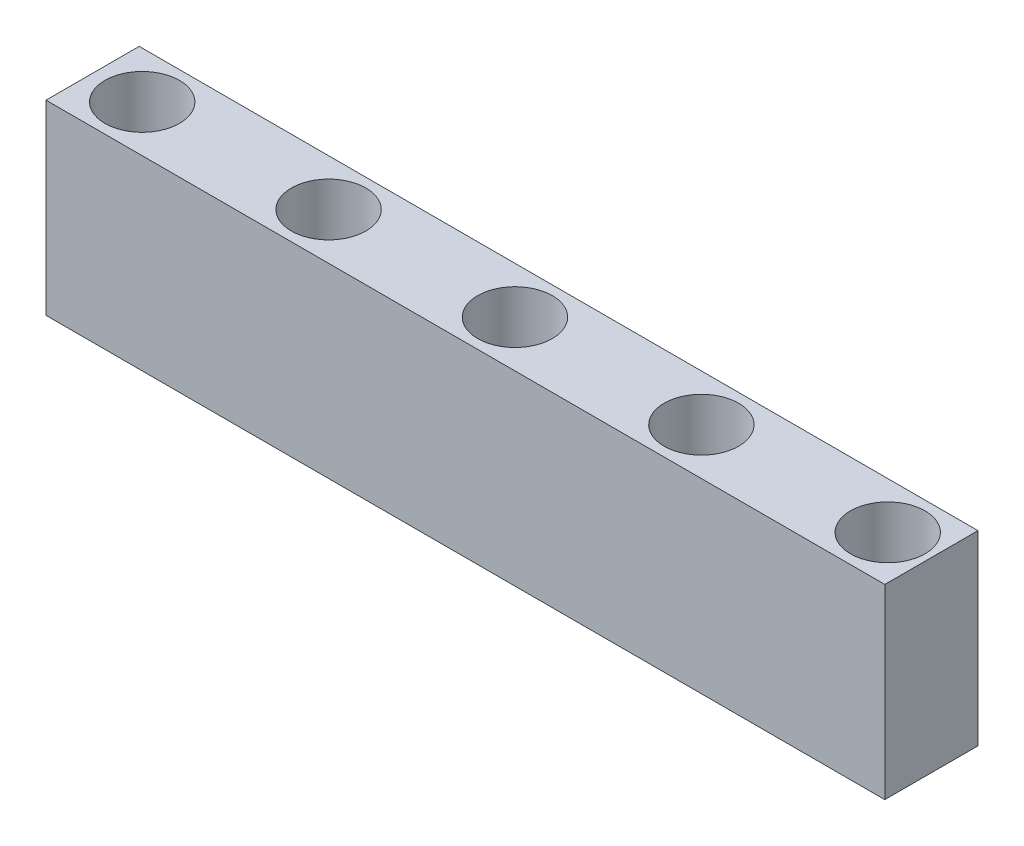
ISO-10303-21;
HEADER;
FILE_DESCRIPTION(('STEP AP214'),'2;1');
FILE_NAME('part.step','',(''),(''),'','','');
FILE_SCHEMA(('AUTOMOTIVE_DESIGN { 1 0 10303 214 1 1 1 1 }'));
ENDSEC;
DATA;
#1=APPLICATION_CONTEXT('core data for automotive mechanical design processes');
#2=APPLICATION_PROTOCOL_DEFINITION('international standard','automotive_design',2000,#1);
#3=PRODUCT_CONTEXT('',#1,'mechanical');
#4=PRODUCT('Part','Part','',(#3));
#5=PRODUCT_RELATED_PRODUCT_CATEGORY('part','',(#4));
#6=PRODUCT_DEFINITION_FORMATION('','',#4);
#7=PRODUCT_DEFINITION_CONTEXT('part definition',#1,'design');
#8=PRODUCT_DEFINITION('design','',#6,#7);
#9=PRODUCT_DEFINITION_SHAPE('','',#8);
#10=(LENGTH_UNIT() NAMED_UNIT(*) SI_UNIT(.MILLI.,.METRE.));
#11=(NAMED_UNIT(*) PLANE_ANGLE_UNIT() SI_UNIT($,.RADIAN.));
#12=(NAMED_UNIT(*) SI_UNIT($,.STERADIAN.) SOLID_ANGLE_UNIT());
#13=UNCERTAINTY_MEASURE_WITH_UNIT(LENGTH_MEASURE(1.E-05),#10,'distance_accuracy_value','');
#14=(GEOMETRIC_REPRESENTATION_CONTEXT(3) GLOBAL_UNCERTAINTY_ASSIGNED_CONTEXT((#13)) GLOBAL_UNIT_ASSIGNED_CONTEXT((#10,
#11,#12)) REPRESENTATION_CONTEXT('',''));
#15=CARTESIAN_POINT('',(0.,0.,0.));
#16=DIRECTION('',(0.,0.,1.));
#17=DIRECTION('',(1.,0.,0.));
#18=AXIS2_PLACEMENT_3D('',#15,#16,#17);
#19=CARTESIAN_POINT('',(0.,10.,0.));
#20=DIRECTION('',(0.,1.,0.));
#21=DIRECTION('',(0.,0.,1.));
#22=AXIS2_PLACEMENT_3D('',#19,#20,#21);
#23=PLANE('',#22);
#24=DIRECTION('',(0.,0.,1.));
#25=VECTOR('',#24,1.);
#26=CARTESIAN_POINT('',(5.0039410444942,10.,-2.5));
#27=LINE('',#26,#25);
#28=CARTESIAN_POINT('',(5.0039410444942,10.,-2.5));
#29=VERTEX_POINT('',#28);
#30=CARTESIAN_POINT('',(5.0039410444942,10.,2.5));
#31=VERTEX_POINT('',#30);
#32=EDGE_CURVE('E54',#29,#31,#27,.T.);
#33=ORIENTED_EDGE('',*,*,#32,.F.);
#34=DIRECTION('',(-1.,0.,0.));
#35=VECTOR('',#34,1.);
#36=CARTESIAN_POINT('',(-40.,10.,-2.5));
#37=LINE('',#36,#35);
#38=CARTESIAN_POINT('',(-40.,10.,-2.5));
#39=VERTEX_POINT('',#38);
#40=EDGE_CURVE('E98',#29,#39,#37,.T.);
#41=ORIENTED_EDGE('',*,*,#40,.T.);
#42=DIRECTION('',(0.,0.,1.));
#43=VECTOR('',#42,1.);
#44=CARTESIAN_POINT('',(-40.,10.,-2.5));
#45=LINE('',#44,#43);
#46=CARTESIAN_POINT('',(-40.,10.,2.5));
#47=VERTEX_POINT('',#46);
#48=EDGE_CURVE('E63',#39,#47,#45,.T.);
#49=ORIENTED_EDGE('',*,*,#48,.T.);
#50=DIRECTION('',(1.,0.,0.));
#51=VECTOR('',#50,1.);
#52=CARTESIAN_POINT('',(-40.,10.,2.5));
#53=LINE('',#52,#51);
#54=EDGE_CURVE('E90',#47,#31,#53,.T.);
#55=ORIENTED_EDGE('',*,*,#54,.T.);
#56=EDGE_LOOP('',(#33,#41,#49,#55));
#57=FACE_BOUND('',#56,.T.);
#58=CARTESIAN_POINT('',(-7.3381992204159,10.,0.));
#59=DIRECTION('',(0.,1.,0.));
#60=DIRECTION('',(0.,0.,1.));
#61=AXIS2_PLACEMENT_3D('',#58,#59,#60);
#62=CIRCLE('',#61,2.);
#63=CARTESIAN_POINT('',(-7.3381992204159,10.,2.));
#64=VERTEX_POINT('',#63);
#65=EDGE_CURVE('E130',#64,#64,#62,.T.);
#66=ORIENTED_EDGE('',*,*,#65,.F.);
#67=EDGE_LOOP('',(#66));
#68=FACE_BOUND('',#67,.T.);
#69=CARTESIAN_POINT('',(-27.3381992204159,10.,0.));
#70=DIRECTION('',(0.,1.,0.));
#71=DIRECTION('',(0.,0.,1.));
#72=AXIS2_PLACEMENT_3D('',#69,#70,#71);
#73=CIRCLE('',#72,2.);
#74=CARTESIAN_POINT('',(-27.3381992204159,10.,2.));
#75=VERTEX_POINT('',#74);
#76=EDGE_CURVE('E114',#75,#75,#73,.T.);
#77=ORIENTED_EDGE('',*,*,#76,.F.);
#78=EDGE_LOOP('',(#77));
#79=FACE_BOUND('',#78,.T.);
#80=CARTESIAN_POINT('',(-37.3381992204159,10.,0.));
#81=DIRECTION('',(0.,1.,0.));
#82=DIRECTION('',(0.,0.,1.));
#83=AXIS2_PLACEMENT_3D('',#80,#81,#82);
#84=CIRCLE('',#83,2.);
#85=CARTESIAN_POINT('',(-37.3381992204159,10.,2.));
#86=VERTEX_POINT('',#85);
#87=EDGE_CURVE('E105',#86,#86,#84,.T.);
#88=ORIENTED_EDGE('',*,*,#87,.F.);
#89=EDGE_LOOP('',(#88));
#90=FACE_BOUND('',#89,.T.);
#91=CARTESIAN_POINT('',(-17.3381992204159,10.,0.));
#92=DIRECTION('',(0.,1.,0.));
#93=DIRECTION('',(0.,0.,1.));
#94=AXIS2_PLACEMENT_3D('',#91,#92,#93);
#95=CIRCLE('',#94,2.);
#96=CARTESIAN_POINT('',(-17.3381992204159,10.,2.));
#97=VERTEX_POINT('',#96);
#98=EDGE_CURVE('E122',#97,#97,#95,.T.);
#99=ORIENTED_EDGE('',*,*,#98,.F.);
#100=EDGE_LOOP('',(#99));
#101=FACE_BOUND('',#100,.T.);
#102=CARTESIAN_POINT('',(2.6618007795841,10.,0.));
#103=DIRECTION('',(0.,1.,0.));
#104=DIRECTION('',(0.,0.,1.));
#105=AXIS2_PLACEMENT_3D('',#102,#103,#104);
#106=CIRCLE('',#105,2.);
#107=CARTESIAN_POINT('',(2.6618007795841,10.,2.));
#108=VERTEX_POINT('',#107);
#109=EDGE_CURVE('E138',#108,#108,#106,.T.);
#110=ORIENTED_EDGE('',*,*,#109,.F.);
#111=EDGE_LOOP('',(#110));
#112=FACE_BOUND('',#111,.T.);
#113=ADVANCED_FACE('F38',(#57,#68,#79,#90,#101,#112),#23,.T.);
#114=CARTESIAN_POINT('',(0.,0.,0.));
#115=DIRECTION('',(0.,1.,0.));
#116=DIRECTION('',(0.,0.,1.));
#117=AXIS2_PLACEMENT_3D('',#114,#115,#116);
#118=PLANE('',#117);
#119=DIRECTION('',(-1.,0.,0.));
#120=VECTOR('',#119,1.);
#121=CARTESIAN_POINT('',(-40.,0.,-2.5));
#122=LINE('',#121,#120);
#123=CARTESIAN_POINT('',(5.0039410444942,0.,-2.5));
#124=VERTEX_POINT('',#123);
#125=CARTESIAN_POINT('',(-40.,0.,-2.5));
#126=VERTEX_POINT('',#125);
#127=EDGE_CURVE('E85',#124,#126,#122,.T.);
#128=ORIENTED_EDGE('',*,*,#127,.F.);
#129=DIRECTION('',(0.,0.,1.));
#130=VECTOR('',#129,1.);
#131=CARTESIAN_POINT('',(5.0039410444942,0.,-2.5));
#132=LINE('',#131,#130);
#133=CARTESIAN_POINT('',(5.0039410444942,0.,2.5));
#134=VERTEX_POINT('',#133);
#135=EDGE_CURVE('E96',#124,#134,#132,.T.);
#136=ORIENTED_EDGE('',*,*,#135,.T.);
#137=DIRECTION('',(1.,0.,0.));
#138=VECTOR('',#137,1.);
#139=CARTESIAN_POINT('',(-40.,0.,2.5));
#140=LINE('',#139,#138);
#141=CARTESIAN_POINT('',(-40.,0.,2.5));
#142=VERTEX_POINT('',#141);
#143=EDGE_CURVE('E84',#142,#134,#140,.T.);
#144=ORIENTED_EDGE('',*,*,#143,.F.);
#145=DIRECTION('',(0.,0.,1.));
#146=VECTOR('',#145,1.);
#147=CARTESIAN_POINT('',(-40.,0.,-2.5));
#148=LINE('',#147,#146);
#149=EDGE_CURVE('E75',#126,#142,#148,.T.);
#150=ORIENTED_EDGE('',*,*,#149,.F.);
#151=EDGE_LOOP('',(#128,#136,#144,#150));
#152=FACE_BOUND('',#151,.T.);
#153=CARTESIAN_POINT('',(-37.3381992204159,0.,0.));
#154=DIRECTION('',(0.,1.,0.));
#155=DIRECTION('',(0.,0.,1.));
#156=AXIS2_PLACEMENT_3D('',#153,#154,#155);
#157=CIRCLE('',#156,2.);
#158=CARTESIAN_POINT('',(-37.3381992204159,0.,2.));
#159=VERTEX_POINT('',#158);
#160=EDGE_CURVE('E110',#159,#159,#157,.T.);
#161=ORIENTED_EDGE('',*,*,#160,.T.);
#162=EDGE_LOOP('',(#161));
#163=FACE_BOUND('',#162,.T.);
#164=CARTESIAN_POINT('',(-27.3381992204159,0.,0.));
#165=DIRECTION('',(0.,1.,0.));
#166=DIRECTION('',(0.,0.,1.));
#167=AXIS2_PLACEMENT_3D('',#164,#165,#166);
#168=CIRCLE('',#167,2.);
#169=CARTESIAN_POINT('',(-27.3381992204159,0.,2.));
#170=VERTEX_POINT('',#169);
#171=EDGE_CURVE('E118',#170,#170,#168,.T.);
#172=ORIENTED_EDGE('',*,*,#171,.T.);
#173=EDGE_LOOP('',(#172));
#174=FACE_BOUND('',#173,.T.);
#175=CARTESIAN_POINT('',(-17.3381992204159,0.,0.));
#176=DIRECTION('',(0.,1.,0.));
#177=DIRECTION('',(0.,0.,1.));
#178=AXIS2_PLACEMENT_3D('',#175,#176,#177);
#179=CIRCLE('',#178,2.);
#180=CARTESIAN_POINT('',(-17.3381992204159,0.,2.));
#181=VERTEX_POINT('',#180);
#182=EDGE_CURVE('E126',#181,#181,#179,.T.);
#183=ORIENTED_EDGE('',*,*,#182,.T.);
#184=EDGE_LOOP('',(#183));
#185=FACE_BOUND('',#184,.T.);
#186=CARTESIAN_POINT('',(-7.3381992204159,0.,0.));
#187=DIRECTION('',(0.,1.,0.));
#188=DIRECTION('',(0.,0.,1.));
#189=AXIS2_PLACEMENT_3D('',#186,#187,#188);
#190=CIRCLE('',#189,2.);
#191=CARTESIAN_POINT('',(-7.3381992204159,0.,2.));
#192=VERTEX_POINT('',#191);
#193=EDGE_CURVE('E134',#192,#192,#190,.T.);
#194=ORIENTED_EDGE('',*,*,#193,.T.);
#195=EDGE_LOOP('',(#194));
#196=FACE_BOUND('',#195,.T.);
#197=CARTESIAN_POINT('',(2.6618007795841,0.,0.));
#198=DIRECTION('',(0.,1.,0.));
#199=DIRECTION('',(0.,0.,1.));
#200=AXIS2_PLACEMENT_3D('',#197,#198,#199);
#201=CIRCLE('',#200,2.);
#202=CARTESIAN_POINT('',(2.6618007795841,0.,2.));
#203=VERTEX_POINT('',#202);
#204=EDGE_CURVE('E142',#203,#203,#201,.T.);
#205=ORIENTED_EDGE('',*,*,#204,.T.);
#206=EDGE_LOOP('',(#205));
#207=FACE_BOUND('',#206,.T.);
#208=ADVANCED_FACE('F93',(#152,#163,#174,#185,#196,#207),#118,.F.);
#209=CARTESIAN_POINT('',(-40.,10.,-2.5));
#210=DIRECTION('',(0.,0.,1.));
#211=DIRECTION('',(1.,0.,0.));
#212=AXIS2_PLACEMENT_3D('',#209,#210,#211);
#213=PLANE('',#212);
#214=ORIENTED_EDGE('',*,*,#40,.F.);
#215=DIRECTION('',(0.,1.,0.));
#216=VECTOR('',#215,1.);
#217=CARTESIAN_POINT('',(5.0039410444942,0.,-2.5));
#218=LINE('',#217,#216);
#219=EDGE_CURVE('E150',#124,#29,#218,.T.);
#220=ORIENTED_EDGE('',*,*,#219,.F.);
#221=ORIENTED_EDGE('',*,*,#127,.T.);
#222=DIRECTION('',(0.,-1.,0.));
#223=VECTOR('',#222,1.);
#224=CARTESIAN_POINT('',(-40.,10.,-2.5));
#225=LINE('',#224,#223);
#226=EDGE_CURVE('E11',#39,#126,#225,.T.);
#227=ORIENTED_EDGE('',*,*,#226,.F.);
#228=EDGE_LOOP('',(#214,#220,#221,#227));
#229=FACE_BOUND('',#228,.T.);
#230=ADVANCED_FACE('F40',(#229),#213,.F.);
#231=CARTESIAN_POINT('',(-40.,10.,-2.5));
#232=DIRECTION('',(1.,0.,0.));
#233=DIRECTION('',(0.,0.,-1.));
#234=AXIS2_PLACEMENT_3D('',#231,#232,#233);
#235=PLANE('',#234);
#236=ORIENTED_EDGE('',*,*,#149,.T.);
#237=DIRECTION('',(0.,-1.,0.));
#238=VECTOR('',#237,1.);
#239=CARTESIAN_POINT('',(-40.,10.,2.5));
#240=LINE('',#239,#238);
#241=EDGE_CURVE('E47',#47,#142,#240,.T.);
#242=ORIENTED_EDGE('',*,*,#241,.F.);
#243=ORIENTED_EDGE('',*,*,#48,.F.);
#244=ORIENTED_EDGE('',*,*,#226,.T.);
#245=EDGE_LOOP('',(#236,#242,#243,#244));
#246=FACE_BOUND('',#245,.T.);
#247=ADVANCED_FACE('F77',(#246),#235,.F.);
#248=CARTESIAN_POINT('',(-40.,10.,2.5));
#249=DIRECTION('',(0.,0.,-1.));
#250=DIRECTION('',(-1.,0.,0.));
#251=AXIS2_PLACEMENT_3D('',#248,#249,#250);
#252=PLANE('',#251);
#253=ORIENTED_EDGE('',*,*,#143,.T.);
#254=DIRECTION('',(0.,1.,0.));
#255=VECTOR('',#254,1.);
#256=CARTESIAN_POINT('',(5.0039410444942,0.,2.5));
#257=LINE('',#256,#255);
#258=EDGE_CURVE('E146',#134,#31,#257,.T.);
#259=ORIENTED_EDGE('',*,*,#258,.T.);
#260=ORIENTED_EDGE('',*,*,#54,.F.);
#261=ORIENTED_EDGE('',*,*,#241,.T.);
#262=EDGE_LOOP('',(#253,#259,#260,#261));
#263=FACE_BOUND('',#262,.T.);
#264=ADVANCED_FACE('F89',(#263),#252,.F.);
#265=CARTESIAN_POINT('',(-37.3381992204159,10.,0.));
#266=DIRECTION('',(0.,-1.,0.));
#267=DIRECTION('',(0.,0.,-1.));
#268=AXIS2_PLACEMENT_3D('',#265,#266,#267);
#269=CYLINDRICAL_SURFACE('',#268,2.);
#270=ORIENTED_EDGE('',*,*,#87,.T.);
#271=EDGE_LOOP('',(#270));
#272=FACE_BOUND('',#271,.T.);
#273=ORIENTED_EDGE('',*,*,#160,.F.);
#274=EDGE_LOOP('',(#273));
#275=FACE_BOUND('',#274,.T.);
#276=ADVANCED_FACE('F184',(#272,#275),#269,.F.);
#277=CARTESIAN_POINT('',(-27.3381992204159,10.,0.));
#278=DIRECTION('',(0.,-1.,0.));
#279=DIRECTION('',(0.,0.,-1.));
#280=AXIS2_PLACEMENT_3D('',#277,#278,#279);
#281=CYLINDRICAL_SURFACE('',#280,2.);
#282=ORIENTED_EDGE('',*,*,#76,.T.);
#283=EDGE_LOOP('',(#282));
#284=FACE_BOUND('',#283,.T.);
#285=ORIENTED_EDGE('',*,*,#171,.F.);
#286=EDGE_LOOP('',(#285));
#287=FACE_BOUND('',#286,.T.);
#288=ADVANCED_FACE('F226',(#284,#287),#281,.F.);
#289=CARTESIAN_POINT('',(-17.3381992204159,10.,0.));
#290=DIRECTION('',(0.,-1.,0.));
#291=DIRECTION('',(0.,0.,-1.));
#292=AXIS2_PLACEMENT_3D('',#289,#290,#291);
#293=CYLINDRICAL_SURFACE('',#292,2.);
#294=ORIENTED_EDGE('',*,*,#98,.T.);
#295=EDGE_LOOP('',(#294));
#296=FACE_BOUND('',#295,.T.);
#297=ORIENTED_EDGE('',*,*,#182,.F.);
#298=EDGE_LOOP('',(#297));
#299=FACE_BOUND('',#298,.T.);
#300=ADVANCED_FACE('F217',(#296,#299),#293,.F.);
#301=CARTESIAN_POINT('',(-7.3381992204159,10.,0.));
#302=DIRECTION('',(0.,-1.,0.));
#303=DIRECTION('',(0.,0.,-1.));
#304=AXIS2_PLACEMENT_3D('',#301,#302,#303);
#305=CYLINDRICAL_SURFACE('',#304,2.);
#306=ORIENTED_EDGE('',*,*,#65,.T.);
#307=EDGE_LOOP('',(#306));
#308=FACE_BOUND('',#307,.T.);
#309=ORIENTED_EDGE('',*,*,#193,.F.);
#310=EDGE_LOOP('',(#309));
#311=FACE_BOUND('',#310,.T.);
#312=ADVANCED_FACE('F173',(#308,#311),#305,.F.);
#313=CARTESIAN_POINT('',(2.6618007795841,10.,0.));
#314=DIRECTION('',(0.,-1.,0.));
#315=DIRECTION('',(0.,0.,-1.));
#316=AXIS2_PLACEMENT_3D('',#313,#314,#315);
#317=CYLINDRICAL_SURFACE('',#316,2.);
#318=ORIENTED_EDGE('',*,*,#109,.T.);
#319=EDGE_LOOP('',(#318));
#320=FACE_BOUND('',#319,.T.);
#321=ORIENTED_EDGE('',*,*,#204,.F.);
#322=EDGE_LOOP('',(#321));
#323=FACE_BOUND('',#322,.T.);
#324=ADVANCED_FACE('F168',(#320,#323),#317,.F.);
#325=CARTESIAN_POINT('',(5.0039410444942,0.,-2.5));
#326=DIRECTION('',(-1.,0.,0.));
#327=DIRECTION('',(0.,0.,1.));
#328=AXIS2_PLACEMENT_3D('',#325,#326,#327);
#329=PLANE('',#328);
#330=ORIENTED_EDGE('',*,*,#32,.T.);
#331=ORIENTED_EDGE('',*,*,#258,.F.);
#332=ORIENTED_EDGE('',*,*,#135,.F.);
#333=ORIENTED_EDGE('',*,*,#219,.T.);
#334=EDGE_LOOP('',(#330,#331,#332,#333));
#335=FACE_BOUND('',#334,.T.);
#336=ADVANCED_FACE('F166',(#335),#329,.F.);
#337=CLOSED_SHELL('',(#113,#208,#230,#247,#264,#276,#288,#300,#312,#324,#336));
#338=MANIFOLD_SOLID_BREP('B2',#337);
#339=ADVANCED_BREP_SHAPE_REPRESENTATION('',(#18,#338),#14);
#340=SHAPE_DEFINITION_REPRESENTATION(#9,#339);
ENDSEC;
END-ISO-10303-21;
